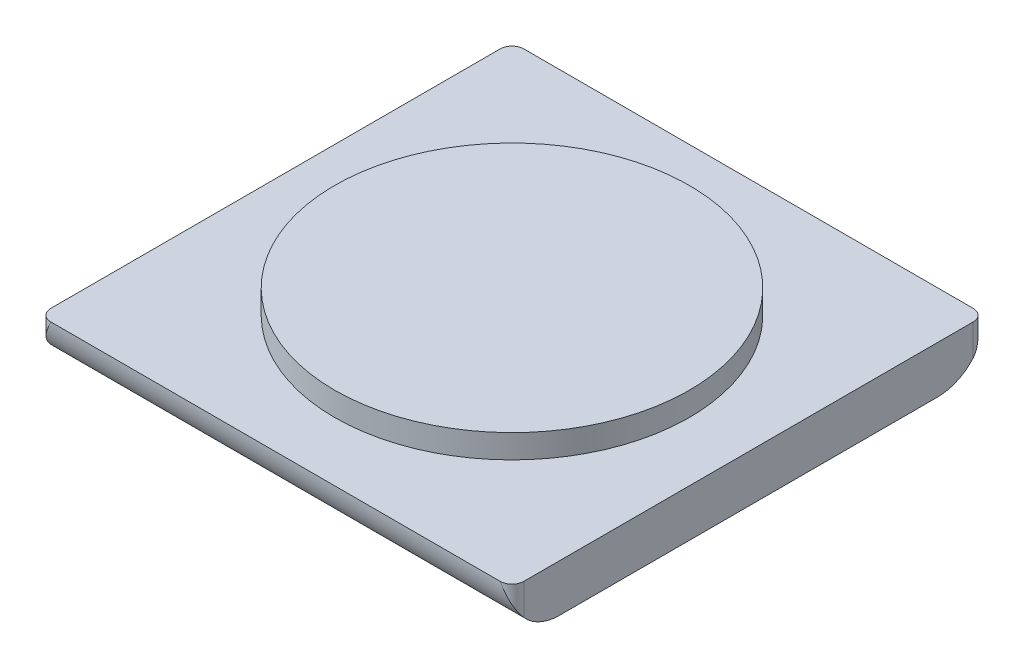
ISO-10303-21;
HEADER;
FILE_DESCRIPTION(('STEP AP214'),'2;1');
FILE_NAME('part.step','',(''),(''),'','','');
FILE_SCHEMA(('AUTOMOTIVE_DESIGN { 1 0 10303 214 1 1 1 1 }'));
ENDSEC;
DATA;
#1=APPLICATION_CONTEXT('core data for automotive mechanical design processes');
#2=APPLICATION_PROTOCOL_DEFINITION('international standard','automotive_design',2000,#1);
#3=PRODUCT_CONTEXT('',#1,'mechanical');
#4=PRODUCT('Part','Part','',(#3));
#5=PRODUCT_RELATED_PRODUCT_CATEGORY('part','',(#4));
#6=PRODUCT_DEFINITION_FORMATION('','',#4);
#7=PRODUCT_DEFINITION_CONTEXT('part definition',#1,'design');
#8=PRODUCT_DEFINITION('design','',#6,#7);
#9=PRODUCT_DEFINITION_SHAPE('','',#8);
#10=(LENGTH_UNIT() NAMED_UNIT(*) SI_UNIT(.MILLI.,.METRE.));
#11=(NAMED_UNIT(*) PLANE_ANGLE_UNIT() SI_UNIT($,.RADIAN.));
#12=(NAMED_UNIT(*) SI_UNIT($,.STERADIAN.) SOLID_ANGLE_UNIT());
#13=UNCERTAINTY_MEASURE_WITH_UNIT(LENGTH_MEASURE(1.E-05),#10,'distance_accuracy_value','');
#14=(GEOMETRIC_REPRESENTATION_CONTEXT(3) GLOBAL_UNCERTAINTY_ASSIGNED_CONTEXT((#13)) GLOBAL_UNIT_ASSIGNED_CONTEXT((#10,
#11,#12)) REPRESENTATION_CONTEXT('',''));
#15=CARTESIAN_POINT('',(0.,0.,0.));
#16=DIRECTION('',(0.,0.,1.));
#17=DIRECTION('',(1.,0.,0.));
#18=AXIS2_PLACEMENT_3D('',#15,#16,#17);
#19=CARTESIAN_POINT('',(99.9999999999999,-20.,-100.));
#20=DIRECTION('',(1.,0.,0.));
#21=DIRECTION('',(0.,0.,-1.));
#22=AXIS2_PLACEMENT_3D('',#19,#20,#21);
#23=PLANE('',#22);
#24=DIRECTION('',(0.,0.,-1.));
#25=VECTOR('',#24,1.);
#26=CARTESIAN_POINT('',(99.9999999999999,-20.,-100.));
#27=LINE('',#26,#25);
#28=CARTESIAN_POINT('',(100.,-20.,80.));
#29=VERTEX_POINT('',#28);
#30=CARTESIAN_POINT('',(99.9999999999999,-20.,-80.));
#31=VERTEX_POINT('',#30);
#32=EDGE_CURVE('E147',#29,#31,#27,.T.);
#33=ORIENTED_EDGE('',*,*,#32,.T.);
#34=CARTESIAN_POINT('',(99.9999999999999,0.,-80.));
#35=DIRECTION('',(1.,0.,0.));
#36=DIRECTION('',(0.,0.,-1.));
#37=AXIS2_PLACEMENT_3D('',#34,#35,#36);
#38=CIRCLE('',#37,20.);
#39=CARTESIAN_POINT('',(99.9999999999999,-13.228756555323,-95.));
#40=VERTEX_POINT('',#39);
#41=EDGE_CURVE('E73',#31,#40,#38,.T.);
#42=ORIENTED_EDGE('',*,*,#41,.T.);
#43=DIRECTION('',(0.,1.,0.));
#44=VECTOR('',#43,1.);
#45=CARTESIAN_POINT('',(99.9999999999999,-20.,-95.));
#46=LINE('',#45,#44);
#47=CARTESIAN_POINT('',(99.9999999999999,0.,-95.));
#48=VERTEX_POINT('',#47);
#49=EDGE_CURVE('E156',#40,#48,#46,.T.);
#50=ORIENTED_EDGE('',*,*,#49,.T.);
#51=DIRECTION('',(0.,0.,-1.));
#52=VECTOR('',#51,1.);
#53=CARTESIAN_POINT('',(99.9999999999999,0.,-100.));
#54=LINE('',#53,#52);
#55=CARTESIAN_POINT('',(100.,0.,95.));
#56=VERTEX_POINT('',#55);
#57=EDGE_CURVE('E211',#56,#48,#54,.T.);
#58=ORIENTED_EDGE('',*,*,#57,.F.);
#59=DIRECTION('',(0.,1.,0.));
#60=VECTOR('',#59,1.);
#61=CARTESIAN_POINT('',(100.,-20.,95.));
#62=LINE('',#61,#60);
#63=CARTESIAN_POINT('',(100.,-13.228756555323,95.));
#64=VERTEX_POINT('',#63);
#65=EDGE_CURVE('E154',#56,#64,#62,.F.);
#66=ORIENTED_EDGE('',*,*,#65,.T.);
#67=CARTESIAN_POINT('',(100.,0.,80.));
#68=DIRECTION('',(1.,0.,0.));
#69=DIRECTION('',(0.,0.,-1.));
#70=AXIS2_PLACEMENT_3D('',#67,#68,#69);
#71=CIRCLE('',#70,20.);
#72=EDGE_CURVE('E193',#64,#29,#71,.T.);
#73=ORIENTED_EDGE('',*,*,#72,.T.);
#74=EDGE_LOOP('',(#33,#42,#50,#58,#66,#73));
#75=FACE_BOUND('',#74,.T.);
#76=ADVANCED_FACE('F45',(#75),#23,.T.);
#77=CARTESIAN_POINT('',(-100.,-20.,-100.));
#78=DIRECTION('',(-1.,0.,0.));
#79=DIRECTION('',(0.,0.,1.));
#80=AXIS2_PLACEMENT_3D('',#77,#78,#79);
#81=PLANE('',#80);
#82=DIRECTION('',(0.,1.,0.));
#83=VECTOR('',#82,1.);
#84=CARTESIAN_POINT('',(-100.,-20.,-95.));
#85=LINE('',#84,#83);
#86=CARTESIAN_POINT('',(-100.,0.,-95.));
#87=VERTEX_POINT('',#86);
#88=CARTESIAN_POINT('',(-100.,-13.228756555323,-95.));
#89=VERTEX_POINT('',#88);
#90=EDGE_CURVE('E133',#87,#89,#85,.F.);
#91=ORIENTED_EDGE('',*,*,#90,.T.);
#92=CARTESIAN_POINT('',(-100.,0.,-80.));
#93=DIRECTION('',(-1.,0.,0.));
#94=DIRECTION('',(0.,0.,1.));
#95=AXIS2_PLACEMENT_3D('',#92,#93,#94);
#96=CIRCLE('',#95,20.);
#97=CARTESIAN_POINT('',(-100.,-20.,-80.));
#98=VERTEX_POINT('',#97);
#99=EDGE_CURVE('E198',#89,#98,#96,.T.);
#100=ORIENTED_EDGE('',*,*,#99,.T.);
#101=DIRECTION('',(0.,0.,1.));
#102=VECTOR('',#101,1.);
#103=CARTESIAN_POINT('',(-100.,-20.,-100.));
#104=LINE('',#103,#102);
#105=CARTESIAN_POINT('',(-100.,-20.,80.));
#106=VERTEX_POINT('',#105);
#107=EDGE_CURVE('E142',#98,#106,#104,.T.);
#108=ORIENTED_EDGE('',*,*,#107,.T.);
#109=CARTESIAN_POINT('',(-100.,0.,80.));
#110=DIRECTION('',(-1.,0.,0.));
#111=DIRECTION('',(0.,0.,1.));
#112=AXIS2_PLACEMENT_3D('',#109,#110,#111);
#113=CIRCLE('',#112,20.);
#114=CARTESIAN_POINT('',(-100.,-13.228756555323,95.));
#115=VERTEX_POINT('',#114);
#116=EDGE_CURVE('E164',#106,#115,#113,.T.);
#117=ORIENTED_EDGE('',*,*,#116,.T.);
#118=DIRECTION('',(0.,1.,0.));
#119=VECTOR('',#118,1.);
#120=CARTESIAN_POINT('',(-100.,-20.,95.));
#121=LINE('',#120,#119);
#122=CARTESIAN_POINT('',(-100.,0.,95.));
#123=VERTEX_POINT('',#122);
#124=EDGE_CURVE('E136',#115,#123,#121,.T.);
#125=ORIENTED_EDGE('',*,*,#124,.T.);
#126=DIRECTION('',(0.,0.,1.));
#127=VECTOR('',#126,1.);
#128=CARTESIAN_POINT('',(-100.,0.,-100.));
#129=LINE('',#128,#127);
#130=EDGE_CURVE('E121',#87,#123,#129,.T.);
#131=ORIENTED_EDGE('',*,*,#130,.F.);
#132=EDGE_LOOP('',(#91,#100,#108,#117,#125,#131));
#133=FACE_BOUND('',#132,.T.);
#134=ADVANCED_FACE('F132',(#133),#81,.T.);
#135=CARTESIAN_POINT('',(0.,-20.,0.));
#136=DIRECTION('',(0.,1.,0.));
#137=DIRECTION('',(0.,0.,1.));
#138=AXIS2_PLACEMENT_3D('',#135,#136,#137);
#139=PLANE('',#138);
#140=ORIENTED_EDGE('',*,*,#107,.F.);
#141=DIRECTION('',(-1.,0.,0.));
#142=VECTOR('',#141,1.);
#143=CARTESIAN_POINT('',(94.9999999999999,-20.,-80.));
#144=LINE('',#143,#142);
#145=EDGE_CURVE('E195',#98,#31,#144,.F.);
#146=ORIENTED_EDGE('',*,*,#145,.T.);
#147=ORIENTED_EDGE('',*,*,#32,.F.);
#148=DIRECTION('',(1.,0.,0.));
#149=VECTOR('',#148,1.);
#150=CARTESIAN_POINT('',(-95.,-20.,80.));
#151=LINE('',#150,#149);
#152=EDGE_CURVE('E197',#29,#106,#151,.F.);
#153=ORIENTED_EDGE('',*,*,#152,.T.);
#154=EDGE_LOOP('',(#140,#146,#147,#153));
#155=FACE_BOUND('',#154,.T.);
#156=ADVANCED_FACE('F225',(#155),#139,.F.);
#157=CARTESIAN_POINT('',(0.,0.,0.));
#158=DIRECTION('',(0.,1.,0.));
#159=DIRECTION('',(0.,0.,1.));
#160=AXIS2_PLACEMENT_3D('',#157,#158,#159);
#161=PLANE('',#160);
#162=ORIENTED_EDGE('',*,*,#130,.T.);
#163=CARTESIAN_POINT('',(-95.,0.,95.));
#164=DIRECTION('',(0.,1.,0.));
#165=DIRECTION('',(0.,0.,1.));
#166=AXIS2_PLACEMENT_3D('',#163,#164,#165);
#167=CIRCLE('',#166,5.);
#168=CARTESIAN_POINT('',(-95.,0.,100.));
#169=VERTEX_POINT('',#168);
#170=EDGE_CURVE('E127',#123,#169,#167,.T.);
#171=ORIENTED_EDGE('',*,*,#170,.T.);
#172=DIRECTION('',(1.,0.,0.));
#173=VECTOR('',#172,1.);
#174=CARTESIAN_POINT('',(-100.,0.,100.));
#175=LINE('',#174,#173);
#176=CARTESIAN_POINT('',(95.,0.,100.));
#177=VERTEX_POINT('',#176);
#178=EDGE_CURVE('E138',#169,#177,#175,.T.);
#179=ORIENTED_EDGE('',*,*,#178,.T.);
#180=CARTESIAN_POINT('',(95.,0.,95.));
#181=DIRECTION('',(0.,1.,0.));
#182=DIRECTION('',(0.,0.,1.));
#183=AXIS2_PLACEMENT_3D('',#180,#181,#182);
#184=CIRCLE('',#183,5.);
#185=EDGE_CURVE('E144',#177,#56,#184,.T.);
#186=ORIENTED_EDGE('',*,*,#185,.T.);
#187=ORIENTED_EDGE('',*,*,#57,.T.);
#188=CARTESIAN_POINT('',(94.9999999999999,0.,-95.));
#189=DIRECTION('',(0.,1.,0.));
#190=DIRECTION('',(0.,0.,1.));
#191=AXIS2_PLACEMENT_3D('',#188,#189,#190);
#192=CIRCLE('',#191,5.);
#193=CARTESIAN_POINT('',(94.9999999999999,0.,-100.));
#194=VERTEX_POINT('',#193);
#195=EDGE_CURVE('E128',#48,#194,#192,.T.);
#196=ORIENTED_EDGE('',*,*,#195,.T.);
#197=DIRECTION('',(-1.,0.,0.));
#198=VECTOR('',#197,1.);
#199=CARTESIAN_POINT('',(-100.,0.,-100.));
#200=LINE('',#199,#198);
#201=CARTESIAN_POINT('',(-95.0000000000001,0.,-100.));
#202=VERTEX_POINT('',#201);
#203=EDGE_CURVE('E124',#194,#202,#200,.T.);
#204=ORIENTED_EDGE('',*,*,#203,.T.);
#205=CARTESIAN_POINT('',(-95.0000000000001,0.,-95.));
#206=DIRECTION('',(0.,1.,0.));
#207=DIRECTION('',(0.,0.,1.));
#208=AXIS2_PLACEMENT_3D('',#205,#206,#207);
#209=CIRCLE('',#208,5.);
#210=EDGE_CURVE('E117',#202,#87,#209,.T.);
#211=ORIENTED_EDGE('',*,*,#210,.T.);
#212=EDGE_LOOP('',(#162,#171,#179,#186,#187,#196,#204,#211));
#213=FACE_BOUND('',#212,.T.);
#214=ADVANCED_FACE('F119',(#213),#161,.T.);
#215=CARTESIAN_POINT('',(-95.,-20.,95.));
#216=DIRECTION('',(0.,1.,0.));
#217=DIRECTION('',(0.,0.,1.));
#218=AXIS2_PLACEMENT_3D('',#215,#216,#217);
#219=CYLINDRICAL_SURFACE('',#218,5.);
#220=ORIENTED_EDGE('',*,*,#124,.F.);
#221=CARTESIAN_POINT('',(-100.,-13.228756555323,95.));
#222=CARTESIAN_POINT('',(-99.9999933858343,-13.1066810089343,95.1076640308409));
#223=CARTESIAN_POINT('',(-99.9965234237763,-12.9833171827775,95.213807332699));
#224=CARTESIAN_POINT('',(-99.9831887541159,-12.7342767270586,95.4228596450103));
#225=CARTESIAN_POINT('',(-99.9733259807412,-12.6086008082213,95.525769623876));
#226=CARTESIAN_POINT('',(-99.9349945502654,-12.228903911724,95.8290450226986));
#227=CARTESIAN_POINT('',(-99.8977783910075,-11.9717154551409,96.0243950526263));
#228=CARTESIAN_POINT('',(-99.804076426246,-11.4527969388026,96.3992417681532));
#229=CARTESIAN_POINT('',(-99.7477493425894,-11.19112062606,96.5788541740257));
#230=CARTESIAN_POINT('',(-99.6187467272344,-10.662267764406,96.9238235685838));
#231=CARTESIAN_POINT('',(-99.5460604487398,-10.3950877052306,97.089171087057));
#232=CARTESIAN_POINT('',(-99.3426437611457,-9.70641547431101,97.4934798351749));
#233=CARTESIAN_POINT('',(-99.2021202994599,-9.28178049308124,97.72220929046));
#234=CARTESIAN_POINT('',(-98.895545533891,-8.42474103344725,98.1453121680365));
#235=CARTESIAN_POINT('',(-98.7294852707417,-7.99233387547412,98.3396734810468));
#236=CARTESIAN_POINT('',(-98.3769716986521,-7.11963786050685,98.6958272659183));
#237=CARTESIAN_POINT('',(-98.1904199739954,-6.67932029128131,98.8574509249166));
#238=CARTESIAN_POINT('',(-97.8025203969275,-5.7945701514007,99.1478389334886));
#239=CARTESIAN_POINT('',(-97.601175094836,-5.35013830151396,99.2766089297878));
#240=CARTESIAN_POINT('',(-97.2070715212466,-4.50018502424415,99.4915869217223));
#241=CARTESIAN_POINT('',(-97.0152851073831,-4.09493294286793,99.580657903267));
#242=CARTESIAN_POINT('',(-96.6253626946623,-3.28274550873548,99.7330783815558));
#243=CARTESIAN_POINT('',(-96.4272263807965,-2.87581007334556,99.7964266000962));
#244=CARTESIAN_POINT('',(-95.8276987081485,-1.65546420916498,99.9481839844703));
#245=CARTESIAN_POINT('',(-95.4199611139461,-0.83992290755447,99.9989539142143));
#246=CARTESIAN_POINT('',(-95.0084326874812,-0.0168653832613433,99.9999946632434));
#247=CARTESIAN_POINT('',(-95.0042163159984,-0.00843264043061974,99.9999999963755));
#248=CARTESIAN_POINT('',(-95.,0.,100.));
#249=B_SPLINE_CURVE_WITH_KNOTS('',3,(#221,#222,#223,#224,#225,#226,#227,#228,#229,#230,#231,
#232,#233,#234,#235,#236,#237,#238,#239,#240,#241,#242,#243,#244,#245,#246,#247,#248),
.UNSPECIFIED.,.F.,.F.,(4,2,2,2,2,2,2,2,2,2,2,2,2,4),(0.,0.488193849119197,0.976240057783841,
1.95034699461197,2.9165540599089,3.88339771500229,5.38821069481493,6.89355282894275,
8.40647006386522,9.91912709059492,11.2895968677426,12.6601347373092,15.3924368215511,
15.4207210973241),.UNSPECIFIED.);
#250=EDGE_CURVE('E12',#115,#169,#249,.T.);
#251=ORIENTED_EDGE('',*,*,#250,.T.);
#252=ORIENTED_EDGE('',*,*,#170,.F.);
#253=EDGE_LOOP('',(#220,#251,#252));
#254=FACE_BOUND('',#253,.T.);
#255=ADVANCED_FACE('F173',(#254),#219,.T.);
#256=CARTESIAN_POINT('',(-95.0000000000001,-20.,-95.));
#257=DIRECTION('',(0.,1.,0.));
#258=DIRECTION('',(0.,0.,1.));
#259=AXIS2_PLACEMENT_3D('',#256,#257,#258);
#260=CYLINDRICAL_SURFACE('',#259,5.);
#261=ORIENTED_EDGE('',*,*,#210,.F.);
#262=CARTESIAN_POINT('',(-100.,-13.228756555323,-95.));
#263=CARTESIAN_POINT('',(-99.9999933858343,-13.1066810089343,-95.1076640308408));
#264=CARTESIAN_POINT('',(-99.9965234237763,-12.9833171827775,-95.2138073326989));
#265=CARTESIAN_POINT('',(-99.9831887541159,-12.7342767270586,-95.4228596450103));
#266=CARTESIAN_POINT('',(-99.9733259807412,-12.6086008082213,-95.525769623876));
#267=CARTESIAN_POINT('',(-99.9349945502654,-12.228903911724,-95.8290450226986));
#268=CARTESIAN_POINT('',(-99.8977783910075,-11.9717154551409,-96.0243950526263));
#269=CARTESIAN_POINT('',(-99.8040764262461,-11.4527969388026,-96.3992417681532));
#270=CARTESIAN_POINT('',(-99.7477493425894,-11.19112062606,-96.5788541740257));
#271=CARTESIAN_POINT('',(-99.6187467272345,-10.662267764406,-96.9238235685838));
#272=CARTESIAN_POINT('',(-99.5460604487398,-10.3950877052306,-97.0891710870569));
#273=CARTESIAN_POINT('',(-99.3426437611457,-9.70641547431101,-97.4934798351749));
#274=CARTESIAN_POINT('',(-99.2021202994599,-9.28178049308124,-97.72220929046));
#275=CARTESIAN_POINT('',(-98.8955455338911,-8.42474103344725,-98.1453121680365));
#276=CARTESIAN_POINT('',(-98.7294852707417,-7.99233387547412,-98.3396734810467));
#277=CARTESIAN_POINT('',(-98.3769716986521,-7.11963786050685,-98.6958272659183));
#278=CARTESIAN_POINT('',(-98.1904199739954,-6.6793202912813,-98.8574509249166));
#279=CARTESIAN_POINT('',(-97.8025203969276,-5.7945701514007,-99.1478389334886));
#280=CARTESIAN_POINT('',(-97.601175094836,-5.35013830151396,-99.2766089297878));
#281=CARTESIAN_POINT('',(-97.2070715212467,-4.50018502424415,-99.4915869217223));
#282=CARTESIAN_POINT('',(-97.0152851073831,-4.09493294286792,-99.580657903267));
#283=CARTESIAN_POINT('',(-96.6253626946623,-3.28274550873547,-99.7330783815557));
#284=CARTESIAN_POINT('',(-96.4272263807965,-2.87581007334556,-99.7964266000962));
#285=CARTESIAN_POINT('',(-95.8276987081486,-1.65546420916498,-99.9481839844703));
#286=CARTESIAN_POINT('',(-95.4199611139461,-0.839922907554469,-99.9989539142142));
#287=CARTESIAN_POINT('',(-95.0084326874812,-0.0168653832613433,-99.9999946632434));
#288=CARTESIAN_POINT('',(-95.0042163159984,-0.00843264043061973,-99.9999999963754));
#289=CARTESIAN_POINT('',(-95.0000000000001,0.,-100.));
#290=B_SPLINE_CURVE_WITH_KNOTS('',3,(#262,#263,#264,#265,#266,#267,#268,#269,#270,#271,#272,
#273,#274,#275,#276,#277,#278,#279,#280,#281,#282,#283,#284,#285,#286,#287,#288,#289),
.UNSPECIFIED.,.F.,.F.,(4,2,2,2,2,2,2,2,2,2,2,2,2,4),(0.,0.488193849119196,0.97624005778384,
1.95034699461197,2.9165540599089,3.88339771500229,5.38821069481493,6.89355282894275,
8.40647006386522,9.91912709059492,11.2895968677426,12.6601347373092,15.3924368215511,
15.4207210973241),.UNSPECIFIED.);
#291=EDGE_CURVE('E141',#202,#89,#290,.F.);
#292=ORIENTED_EDGE('',*,*,#291,.T.);
#293=ORIENTED_EDGE('',*,*,#90,.F.);
#294=EDGE_LOOP('',(#261,#292,#293));
#295=FACE_BOUND('',#294,.T.);
#296=ADVANCED_FACE('F140',(#295),#260,.T.);
#297=CARTESIAN_POINT('',(94.9999999999999,-20.,-95.));
#298=DIRECTION('',(0.,1.,0.));
#299=DIRECTION('',(0.,0.,1.));
#300=AXIS2_PLACEMENT_3D('',#297,#298,#299);
#301=CYLINDRICAL_SURFACE('',#300,5.);
#302=ORIENTED_EDGE('',*,*,#49,.F.);
#303=CARTESIAN_POINT('',(99.9999999999999,-13.228756555323,-95.));
#304=CARTESIAN_POINT('',(99.9999933858342,-13.1066810089343,-95.1076640308408));
#305=CARTESIAN_POINT('',(99.9965234237762,-12.9833171827775,-95.2138073326989));
#306=CARTESIAN_POINT('',(99.9831887541158,-12.7342767270586,-95.4228596450103));
#307=CARTESIAN_POINT('',(99.9733259807411,-12.6086008082213,-95.525769623876));
#308=CARTESIAN_POINT('',(99.9349945502653,-12.228903911724,-95.8290450226986));
#309=CARTESIAN_POINT('',(99.8977783910074,-11.9717154551409,-96.0243950526263));
#310=CARTESIAN_POINT('',(99.804076426246,-11.4527969388026,-96.3992417681532));
#311=CARTESIAN_POINT('',(99.7477493425893,-11.19112062606,-96.5788541740257));
#312=CARTESIAN_POINT('',(99.6187467272343,-10.662267764406,-96.9238235685838));
#313=CARTESIAN_POINT('',(99.5460604487397,-10.3950877052306,-97.0891710870569));
#314=CARTESIAN_POINT('',(99.3426437611456,-9.70641547431101,-97.4934798351749));
#315=CARTESIAN_POINT('',(99.2021202994598,-9.28178049308124,-97.72220929046));
#316=CARTESIAN_POINT('',(98.895545533891,-8.42474103344725,-98.1453121680365));
#317=CARTESIAN_POINT('',(98.7294852707416,-7.99233387547412,-98.3396734810467));
#318=CARTESIAN_POINT('',(98.376971698652,-7.11963786050685,-98.6958272659183));
#319=CARTESIAN_POINT('',(98.1904199739953,-6.6793202912813,-98.8574509249166));
#320=CARTESIAN_POINT('',(97.8025203969274,-5.7945701514007,-99.1478389334886));
#321=CARTESIAN_POINT('',(97.6011750948359,-5.35013830151396,-99.2766089297878));
#322=CARTESIAN_POINT('',(97.2070715212466,-4.50018502424415,-99.4915869217223));
#323=CARTESIAN_POINT('',(97.015285107383,-4.09493294286792,-99.580657903267));
#324=CARTESIAN_POINT('',(96.6253626946622,-3.28274550873547,-99.7330783815557));
#325=CARTESIAN_POINT('',(96.4272263807964,-2.87581007334556,-99.7964266000962));
#326=CARTESIAN_POINT('',(95.8276987081484,-1.65546420916498,-99.9481839844703));
#327=CARTESIAN_POINT('',(95.419961113946,-0.839922907554469,-99.9989539142142));
#328=CARTESIAN_POINT('',(95.0084326874811,-0.0168653832613433,-99.9999946632434));
#329=CARTESIAN_POINT('',(95.0042163159983,-0.00843264043061973,-99.9999999963754));
#330=CARTESIAN_POINT('',(94.9999999999999,0.,-100.));
#331=B_SPLINE_CURVE_WITH_KNOTS('',3,(#303,#304,#305,#306,#307,#308,#309,#310,#311,#312,#313,
#314,#315,#316,#317,#318,#319,#320,#321,#322,#323,#324,#325,#326,#327,#328,#329,#330),
.UNSPECIFIED.,.F.,.F.,(4,2,2,2,2,2,2,2,2,2,2,2,2,4),(0.,0.488193849119196,0.97624005778384,
1.95034699461197,2.9165540599089,3.88339771500229,5.38821069481493,6.89355282894275,
8.40647006386522,9.91912709059492,11.2895968677426,12.6601347373092,15.3924368215511,
15.4207210973241),.UNSPECIFIED.);
#332=EDGE_CURVE('E182',#40,#194,#331,.T.);
#333=ORIENTED_EDGE('',*,*,#332,.T.);
#334=ORIENTED_EDGE('',*,*,#195,.F.);
#335=EDGE_LOOP('',(#302,#333,#334));
#336=FACE_BOUND('',#335,.T.);
#337=ADVANCED_FACE('F172',(#336),#301,.T.);
#338=CARTESIAN_POINT('',(95.,-20.,95.));
#339=DIRECTION('',(0.,1.,0.));
#340=DIRECTION('',(0.,0.,1.));
#341=AXIS2_PLACEMENT_3D('',#338,#339,#340);
#342=CYLINDRICAL_SURFACE('',#341,5.);
#343=ORIENTED_EDGE('',*,*,#185,.F.);
#344=CARTESIAN_POINT('',(100.,-13.228756555323,95.));
#345=CARTESIAN_POINT('',(99.9999933858343,-13.1066810089343,95.1076640308409));
#346=CARTESIAN_POINT('',(99.9965234237763,-12.9833171827775,95.213807332699));
#347=CARTESIAN_POINT('',(99.9831887541159,-12.7342767270586,95.4228596450103));
#348=CARTESIAN_POINT('',(99.9733259807412,-12.6086008082213,95.525769623876));
#349=CARTESIAN_POINT('',(99.9349945502654,-12.228903911724,95.8290450226986));
#350=CARTESIAN_POINT('',(99.8977783910075,-11.9717154551409,96.0243950526263));
#351=CARTESIAN_POINT('',(99.804076426246,-11.4527969388026,96.3992417681532));
#352=CARTESIAN_POINT('',(99.7477493425894,-11.19112062606,96.5788541740257));
#353=CARTESIAN_POINT('',(99.6187467272344,-10.662267764406,96.9238235685838));
#354=CARTESIAN_POINT('',(99.5460604487398,-10.3950877052306,97.089171087057));
#355=CARTESIAN_POINT('',(99.3426437611457,-9.70641547431101,97.4934798351749));
#356=CARTESIAN_POINT('',(99.2021202994598,-9.28178049308124,97.72220929046));
#357=CARTESIAN_POINT('',(98.895545533891,-8.42474103344725,98.1453121680365));
#358=CARTESIAN_POINT('',(98.7294852707417,-7.99233387547412,98.3396734810468));
#359=CARTESIAN_POINT('',(98.3769716986521,-7.11963786050685,98.6958272659183));
#360=CARTESIAN_POINT('',(98.1904199739954,-6.6793202912813,98.8574509249166));
#361=CARTESIAN_POINT('',(97.8025203969275,-5.7945701514007,99.1478389334886));
#362=CARTESIAN_POINT('',(97.601175094836,-5.35013830151396,99.2766089297878));
#363=CARTESIAN_POINT('',(97.2070715212466,-4.50018502424415,99.4915869217223));
#364=CARTESIAN_POINT('',(97.015285107383,-4.09493294286792,99.580657903267));
#365=CARTESIAN_POINT('',(96.6253626946623,-3.28274550873547,99.7330783815558));
#366=CARTESIAN_POINT('',(96.4272263807965,-2.87581007334556,99.7964266000962));
#367=CARTESIAN_POINT('',(95.8276987081485,-1.65546420916498,99.9481839844703));
#368=CARTESIAN_POINT('',(95.4199611139461,-0.839922907554469,99.9989539142143));
#369=CARTESIAN_POINT('',(95.0084326874811,-0.0168653832613433,99.9999946632434));
#370=CARTESIAN_POINT('',(95.0042163159983,-0.00843264043061973,99.9999999963755));
#371=CARTESIAN_POINT('',(95.,0.,100.));
#372=B_SPLINE_CURVE_WITH_KNOTS('',3,(#344,#345,#346,#347,#348,#349,#350,#351,#352,#353,#354,
#355,#356,#357,#358,#359,#360,#361,#362,#363,#364,#365,#366,#367,#368,#369,#370,#371),
.UNSPECIFIED.,.F.,.F.,(4,2,2,2,2,2,2,2,2,2,2,2,2,4),(0.,0.488193849119197,0.976240057783841,
1.95034699461197,2.91655405990891,3.88339771500229,5.38821069481493,6.89355282894275,
8.40647006386522,9.91912709059492,11.2895968677426,12.6601347373092,15.3924368215511,
15.4207210973241),.UNSPECIFIED.);
#373=EDGE_CURVE('E59',#177,#64,#372,.F.);
#374=ORIENTED_EDGE('',*,*,#373,.T.);
#375=ORIENTED_EDGE('',*,*,#65,.F.);
#376=EDGE_LOOP('',(#343,#374,#375));
#377=FACE_BOUND('',#376,.T.);
#378=ADVANCED_FACE('F178',(#377),#342,.T.);
#379=CARTESIAN_POINT('',(-100.,0.,-80.));
#380=DIRECTION('',(1.,0.,0.));
#381=DIRECTION('',(0.,0.,-1.));
#382=AXIS2_PLACEMENT_3D('',#379,#380,#381);
#383=CYLINDRICAL_SURFACE('',#382,20.);
#384=ORIENTED_EDGE('',*,*,#41,.F.);
#385=ORIENTED_EDGE('',*,*,#145,.F.);
#386=ORIENTED_EDGE('',*,*,#99,.F.);
#387=ORIENTED_EDGE('',*,*,#291,.F.);
#388=ORIENTED_EDGE('',*,*,#203,.F.);
#389=ORIENTED_EDGE('',*,*,#332,.F.);
#390=EDGE_LOOP('',(#384,#385,#386,#387,#388,#389));
#391=FACE_BOUND('',#390,.T.);
#392=ADVANCED_FACE('F166',(#391),#383,.T.);
#393=CARTESIAN_POINT('',(-100.,0.,80.));
#394=DIRECTION('',(-1.,0.,0.));
#395=DIRECTION('',(0.,0.,1.));
#396=AXIS2_PLACEMENT_3D('',#393,#394,#395);
#397=CYLINDRICAL_SURFACE('',#396,20.);
#398=ORIENTED_EDGE('',*,*,#116,.F.);
#399=ORIENTED_EDGE('',*,*,#152,.F.);
#400=ORIENTED_EDGE('',*,*,#72,.F.);
#401=ORIENTED_EDGE('',*,*,#373,.F.);
#402=ORIENTED_EDGE('',*,*,#178,.F.);
#403=ORIENTED_EDGE('',*,*,#250,.F.);
#404=EDGE_LOOP('',(#398,#399,#400,#401,#402,#403));
#405=FACE_BOUND('',#404,.T.);
#406=ADVANCED_FACE('F47',(#405),#397,.T.);
#407=CLOSED_SHELL('',(#76,#134,#156,#214,#255,#296,#337,#378,#392,#406));
#408=MANIFOLD_SOLID_BREP('B2',#407);
#409=CARTESIAN_POINT('',(0.,10.,0.));
#410=DIRECTION('',(0.,-1.,0.));
#411=DIRECTION('',(0.,0.,-1.));
#412=AXIS2_PLACEMENT_3D('',#409,#410,#411);
#413=CYLINDRICAL_SURFACE('',#412,75.);
#414=CARTESIAN_POINT('',(0.,10.,0.));
#415=DIRECTION('',(0.,1.,0.));
#416=DIRECTION('',(0.,0.,1.));
#417=AXIS2_PLACEMENT_3D('',#414,#415,#416);
#418=CIRCLE('',#417,75.);
#419=CARTESIAN_POINT('',(0.,10.,75.));
#420=VERTEX_POINT('',#419);
#421=EDGE_CURVE('E44',#420,#420,#418,.T.);
#422=ORIENTED_EDGE('',*,*,#421,.F.);
#423=EDGE_LOOP('',(#422));
#424=FACE_BOUND('',#423,.T.);
#425=CARTESIAN_POINT('',(0.,0.,0.));
#426=DIRECTION('',(0.,1.,0.));
#427=DIRECTION('',(0.,0.,1.));
#428=AXIS2_PLACEMENT_3D('',#425,#426,#427);
#429=CIRCLE('',#428,75.);
#430=CARTESIAN_POINT('',(0.,0.,75.));
#431=VERTEX_POINT('',#430);
#432=EDGE_CURVE('E300',#431,#431,#429,.T.);
#433=ORIENTED_EDGE('',*,*,#432,.T.);
#434=EDGE_LOOP('',(#433));
#435=FACE_BOUND('',#434,.T.);
#436=ADVANCED_FACE('F297',(#424,#435),#413,.T.);
#437=CARTESIAN_POINT('',(0.,10.,0.));
#438=DIRECTION('',(0.,1.,0.));
#439=DIRECTION('',(0.,0.,1.));
#440=AXIS2_PLACEMENT_3D('',#437,#438,#439);
#441=PLANE('',#440);
#442=ORIENTED_EDGE('',*,*,#421,.T.);
#443=EDGE_LOOP('',(#442));
#444=FACE_BOUND('',#443,.T.);
#445=ADVANCED_FACE('F312',(#444),#441,.T.);
#446=CARTESIAN_POINT('',(0.,0.,0.));
#447=DIRECTION('',(0.,1.,0.));
#448=DIRECTION('',(0.,0.,1.));
#449=AXIS2_PLACEMENT_3D('',#446,#447,#448);
#450=PLANE('',#449);
#451=ORIENTED_EDGE('',*,*,#432,.F.);
#452=EDGE_LOOP('',(#451));
#453=FACE_BOUND('',#452,.T.);
#454=ADVANCED_FACE('F310',(#453),#450,.F.);
#455=CLOSED_SHELL('',(#436,#445,#454));
#456=MANIFOLD_SOLID_BREP('B6',#455);
#457=ADVANCED_BREP_SHAPE_REPRESENTATION('',(#18,#408,#456),#14);
#458=SHAPE_DEFINITION_REPRESENTATION(#9,#457);
ENDSEC;
END-ISO-10303-21;
